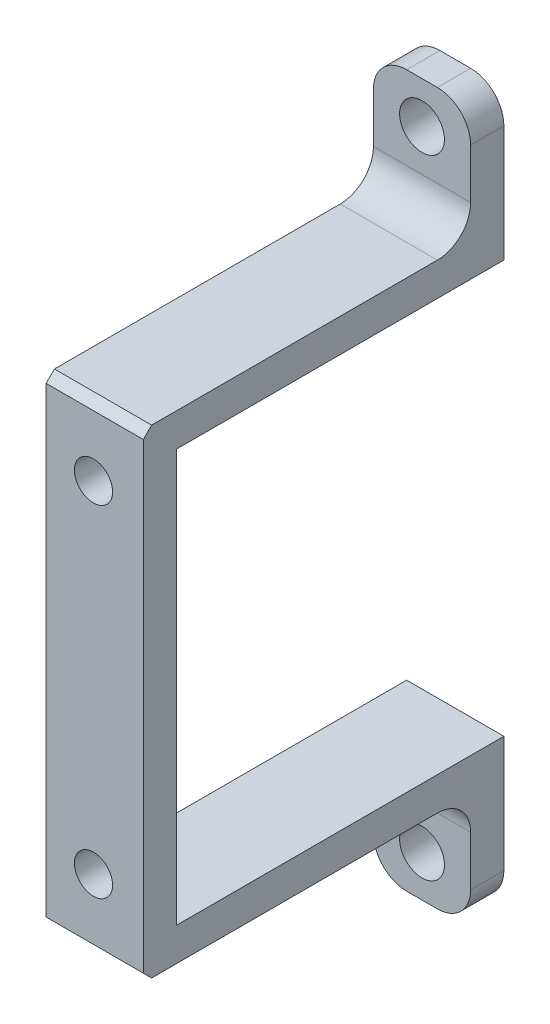
ISO-10303-21;
HEADER;
FILE_DESCRIPTION(('STEP AP214'),'2;1');
FILE_NAME('part.step','',(''),(''),'','','');
FILE_SCHEMA(('AUTOMOTIVE_DESIGN { 1 0 10303 214 1 1 1 1 }'));
ENDSEC;
DATA;
#1=APPLICATION_CONTEXT('core data for automotive mechanical design processes');
#2=APPLICATION_PROTOCOL_DEFINITION('international standard','automotive_design',2000,#1);
#3=PRODUCT_CONTEXT('',#1,'mechanical');
#4=PRODUCT('Part','Part','',(#3));
#5=PRODUCT_RELATED_PRODUCT_CATEGORY('part','',(#4));
#6=PRODUCT_DEFINITION_FORMATION('','',#4);
#7=PRODUCT_DEFINITION_CONTEXT('part definition',#1,'design');
#8=PRODUCT_DEFINITION('design','',#6,#7);
#9=PRODUCT_DEFINITION_SHAPE('','',#8);
#10=(LENGTH_UNIT() NAMED_UNIT(*) SI_UNIT(.MILLI.,.METRE.));
#11=(NAMED_UNIT(*) PLANE_ANGLE_UNIT() SI_UNIT($,.RADIAN.));
#12=(NAMED_UNIT(*) SI_UNIT($,.STERADIAN.) SOLID_ANGLE_UNIT());
#13=UNCERTAINTY_MEASURE_WITH_UNIT(LENGTH_MEASURE(1.E-05),#10,'distance_accuracy_value','');
#14=(GEOMETRIC_REPRESENTATION_CONTEXT(3) GLOBAL_UNCERTAINTY_ASSIGNED_CONTEXT((#13)) GLOBAL_UNIT_ASSIGNED_CONTEXT((#10,
#11,#12)) REPRESENTATION_CONTEXT('',''));
#15=CARTESIAN_POINT('',(0.,0.,0.));
#16=DIRECTION('',(0.,0.,1.));
#17=DIRECTION('',(1.,0.,0.));
#18=AXIS2_PLACEMENT_3D('',#15,#16,#17);
#19=CARTESIAN_POINT('',(-26.2674017645319,-14.41,40.7));
#20=DIRECTION('',(0.,0.707106781186548,-0.707106781186548));
#21=DIRECTION('',(-1.,0.,0.));
#22=AXIS2_PLACEMENT_3D('',#19,#20,#21);
#23=PLANE('',#22);
#24=DIRECTION('',(0.,-0.707106781186548,-0.707106781186548));
#25=VECTOR('',#24,1.);
#26=CARTESIAN_POINT('',(-23.3424017645318,-14.41,40.7));
#27=LINE('',#26,#25);
#28=CARTESIAN_POINT('',(-23.3424017645318,-13.91,41.2));
#29=VERTEX_POINT('',#28);
#30=CARTESIAN_POINT('',(-23.3424017645318,-14.41,40.7));
#31=VERTEX_POINT('',#30);
#32=EDGE_CURVE('E369',#29,#31,#27,.T.);
#33=ORIENTED_EDGE('',*,*,#32,.F.);
#34=DIRECTION('',(1.,0.,0.));
#35=VECTOR('',#34,1.);
#36=CARTESIAN_POINT('',(-38.4174017645319,-13.91,41.2));
#37=LINE('',#36,#35);
#38=CARTESIAN_POINT('',(-29.1924017645318,-13.91,41.2));
#39=VERTEX_POINT('',#38);
#40=EDGE_CURVE('E275',#39,#29,#37,.T.);
#41=ORIENTED_EDGE('',*,*,#40,.F.);
#42=DIRECTION('',(0.,0.707106781186548,0.707106781186548));
#43=VECTOR('',#42,1.);
#44=CARTESIAN_POINT('',(-29.1924017645318,-6.955,48.155));
#45=LINE('',#44,#43);
#46=CARTESIAN_POINT('',(-29.1924017645318,-14.41,40.7));
#47=VERTEX_POINT('',#46);
#48=EDGE_CURVE('E268',#47,#39,#45,.T.);
#49=ORIENTED_EDGE('',*,*,#48,.F.);
#50=DIRECTION('',(-1.,0.,0.));
#51=VECTOR('',#50,1.);
#52=CARTESIAN_POINT('',(-26.2674017645319,-14.41,40.7));
#53=LINE('',#52,#51);
#54=EDGE_CURVE('E374',#31,#47,#53,.T.);
#55=ORIENTED_EDGE('',*,*,#54,.F.);
#56=EDGE_LOOP('',(#33,#41,#49,#55));
#57=FACE_BOUND('',#56,.T.);
#58=ADVANCED_FACE('F17',(#57),#23,.F.);
#59=CARTESIAN_POINT('',(-38.4174017645319,13.91,41.2));
#60=DIRECTION('',(0.,0.707106781186548,0.707106781186548));
#61=DIRECTION('',(1.,0.,0.));
#62=AXIS2_PLACEMENT_3D('',#59,#60,#61);
#63=PLANE('',#62);
#64=DIRECTION('',(0.,-0.707106781186548,0.707106781186548));
#65=VECTOR('',#64,1.);
#66=CARTESIAN_POINT('',(-23.3424017645318,13.91,41.2));
#67=LINE('',#66,#65);
#68=CARTESIAN_POINT('',(-23.3424017645318,14.41,40.7));
#69=VERTEX_POINT('',#68);
#70=CARTESIAN_POINT('',(-23.3424017645318,13.91,41.2));
#71=VERTEX_POINT('',#70);
#72=EDGE_CURVE('E387',#69,#71,#67,.T.);
#73=ORIENTED_EDGE('',*,*,#72,.F.);
#74=DIRECTION('',(1.,0.,0.));
#75=VECTOR('',#74,1.);
#76=CARTESIAN_POINT('',(-23.3424017645318,14.41,40.7));
#77=LINE('',#76,#75);
#78=CARTESIAN_POINT('',(-29.1924017645318,14.41,40.7));
#79=VERTEX_POINT('',#78);
#80=EDGE_CURVE('E407',#79,#69,#77,.T.);
#81=ORIENTED_EDGE('',*,*,#80,.F.);
#82=DIRECTION('',(0.,0.707106781186548,-0.707106781186548));
#83=VECTOR('',#82,1.);
#84=CARTESIAN_POINT('',(-29.1924017645318,6.955,48.155));
#85=LINE('',#84,#83);
#86=CARTESIAN_POINT('',(-29.1924017645318,13.91,41.2));
#87=VERTEX_POINT('',#86);
#88=EDGE_CURVE('E234',#87,#79,#85,.T.);
#89=ORIENTED_EDGE('',*,*,#88,.F.);
#90=DIRECTION('',(-1.,0.,0.));
#91=VECTOR('',#90,1.);
#92=CARTESIAN_POINT('',(-29.1924017645318,13.91,41.2));
#93=LINE('',#92,#91);
#94=EDGE_CURVE('E272',#71,#87,#93,.T.);
#95=ORIENTED_EDGE('',*,*,#94,.F.);
#96=EDGE_LOOP('',(#73,#81,#89,#95));
#97=FACE_BOUND('',#96,.T.);
#98=ADVANCED_FACE('F350',(#97),#63,.T.);
#99=CARTESIAN_POINT('',(-26.2674017645319,18.91,21.5));
#100=DIRECTION('',(0.,0.,-1.));
#101=DIRECTION('',(-1.,0.,0.));
#102=AXIS2_PLACEMENT_3D('',#99,#100,#101);
#103=CYLINDRICAL_SURFACE('',#102,1.35);
#104=CARTESIAN_POINT('',(-26.2674017645319,18.91,19.5));
#105=DIRECTION('',(0.,0.,-1.));
#106=DIRECTION('',(1.,0.,0.));
#107=AXIS2_PLACEMENT_3D('',#104,#105,#106);
#108=CIRCLE('',#107,1.35);
#109=CARTESIAN_POINT('',(-24.9174017645318,18.91,19.5));
#110=VERTEX_POINT('',#109);
#111=EDGE_CURVE('E294',#110,#110,#108,.T.);
#112=ORIENTED_EDGE('',*,*,#111,.T.);
#113=EDGE_LOOP('',(#112));
#114=FACE_BOUND('',#113,.T.);
#115=CARTESIAN_POINT('',(-26.2674017645319,18.91,21.5));
#116=DIRECTION('',(0.,0.,-1.));
#117=DIRECTION('',(-1.,0.,0.));
#118=AXIS2_PLACEMENT_3D('',#115,#116,#117);
#119=CIRCLE('',#118,1.35);
#120=CARTESIAN_POINT('',(-27.6174017645319,18.91,21.5));
#121=VERTEX_POINT('',#120);
#122=EDGE_CURVE('E311',#121,#121,#119,.T.);
#123=ORIENTED_EDGE('',*,*,#122,.F.);
#124=EDGE_LOOP('',(#123));
#125=FACE_BOUND('',#124,.T.);
#126=ADVANCED_FACE('F347',(#114,#125),#103,.F.);
#127=CARTESIAN_POINT('',(-26.2674017645318,-18.91,21.5));
#128=DIRECTION('',(0.,0.,-1.));
#129=DIRECTION('',(-1.,0.,0.));
#130=AXIS2_PLACEMENT_3D('',#127,#128,#129);
#131=CYLINDRICAL_SURFACE('',#130,1.35);
#132=CARTESIAN_POINT('',(-26.2674017645318,-18.91,19.5));
#133=DIRECTION('',(0.,0.,-1.));
#134=DIRECTION('',(1.,0.,0.));
#135=AXIS2_PLACEMENT_3D('',#132,#133,#134);
#136=CIRCLE('',#135,1.35);
#137=CARTESIAN_POINT('',(-24.9174017645318,-18.91,19.5));
#138=VERTEX_POINT('',#137);
#139=EDGE_CURVE('E278',#138,#138,#136,.T.);
#140=ORIENTED_EDGE('',*,*,#139,.T.);
#141=EDGE_LOOP('',(#140));
#142=FACE_BOUND('',#141,.T.);
#143=CARTESIAN_POINT('',(-26.2674017645318,-18.91,21.5));
#144=DIRECTION('',(0.,0.,-1.));
#145=DIRECTION('',(-1.,0.,0.));
#146=AXIS2_PLACEMENT_3D('',#143,#144,#145);
#147=CIRCLE('',#146,1.35);
#148=CARTESIAN_POINT('',(-27.6174017645318,-18.91,21.5));
#149=VERTEX_POINT('',#148);
#150=EDGE_CURVE('E190',#149,#149,#147,.T.);
#151=ORIENTED_EDGE('',*,*,#150,.F.);
#152=EDGE_LOOP('',(#151));
#153=FACE_BOUND('',#152,.T.);
#154=ADVANCED_FACE('F349',(#142,#153),#131,.F.);
#155=CARTESIAN_POINT('',(-26.2674017645319,-16.41,23.5));
#156=DIRECTION('',(-1.,0.,0.));
#157=DIRECTION('',(0.,0.,1.));
#158=AXIS2_PLACEMENT_3D('',#155,#156,#157);
#159=CYLINDRICAL_SURFACE('',#158,2.);
#160=CARTESIAN_POINT('',(-29.1924017645318,-16.41,23.5));
#161=DIRECTION('',(1.,0.,0.));
#162=DIRECTION('',(0.,0.,1.));
#163=AXIS2_PLACEMENT_3D('',#160,#161,#162);
#164=CIRCLE('',#163,2.);
#165=CARTESIAN_POINT('',(-29.1924017645318,-16.41,21.5));
#166=VERTEX_POINT('',#165);
#167=CARTESIAN_POINT('',(-29.1924017645318,-14.41,23.5));
#168=VERTEX_POINT('',#167);
#169=EDGE_CURVE('E264',#166,#168,#164,.T.);
#170=ORIENTED_EDGE('',*,*,#169,.F.);
#171=DIRECTION('',(-1.,0.,0.));
#172=VECTOR('',#171,1.);
#173=CARTESIAN_POINT('',(-29.1924017645318,-16.41,21.5));
#174=LINE('',#173,#172);
#175=CARTESIAN_POINT('',(-23.3424017645318,-16.41,21.5));
#176=VERTEX_POINT('',#175);
#177=EDGE_CURVE('E213',#176,#166,#174,.T.);
#178=ORIENTED_EDGE('',*,*,#177,.F.);
#179=CARTESIAN_POINT('',(-23.3424017645318,-16.41,23.5));
#180=DIRECTION('',(-1.,0.,0.));
#181=DIRECTION('',(0.,0.,1.));
#182=AXIS2_PLACEMENT_3D('',#179,#180,#181);
#183=CIRCLE('',#182,2.);
#184=CARTESIAN_POINT('',(-23.3424017645318,-14.41,23.5));
#185=VERTEX_POINT('',#184);
#186=EDGE_CURVE('E379',#185,#176,#183,.T.);
#187=ORIENTED_EDGE('',*,*,#186,.F.);
#188=DIRECTION('',(1.,0.,0.));
#189=VECTOR('',#188,1.);
#190=CARTESIAN_POINT('',(-23.3424017645318,-14.41,23.5));
#191=LINE('',#190,#189);
#192=EDGE_CURVE('E398',#168,#185,#191,.T.);
#193=ORIENTED_EDGE('',*,*,#192,.F.);
#194=EDGE_LOOP('',(#170,#178,#187,#193));
#195=FACE_BOUND('',#194,.T.);
#196=ADVANCED_FACE('F358',(#195),#159,.F.);
#197=CARTESIAN_POINT('',(-29.1944017645318,16.41,23.5));
#198=DIRECTION('',(-1.,0.,0.));
#199=DIRECTION('',(0.,0.,1.));
#200=AXIS2_PLACEMENT_3D('',#197,#198,#199);
#201=CYLINDRICAL_SURFACE('',#200,2.);
#202=CARTESIAN_POINT('',(-29.1924017645318,16.41,23.5));
#203=DIRECTION('',(1.,0.,0.));
#204=DIRECTION('',(0.,0.,1.));
#205=AXIS2_PLACEMENT_3D('',#202,#203,#204);
#206=CIRCLE('',#205,2.);
#207=CARTESIAN_POINT('',(-29.1924017645318,14.41,23.5));
#208=VERTEX_POINT('',#207);
#209=CARTESIAN_POINT('',(-29.1924017645318,16.41,21.5));
#210=VERTEX_POINT('',#209);
#211=EDGE_CURVE('E235',#208,#210,#206,.T.);
#212=ORIENTED_EDGE('',*,*,#211,.F.);
#213=DIRECTION('',(-1.,0.,0.));
#214=VECTOR('',#213,1.);
#215=CARTESIAN_POINT('',(-29.1924017645318,14.41,23.5));
#216=LINE('',#215,#214);
#217=CARTESIAN_POINT('',(-23.3424017645318,14.41,23.5));
#218=VERTEX_POINT('',#217);
#219=EDGE_CURVE('E421',#218,#208,#216,.T.);
#220=ORIENTED_EDGE('',*,*,#219,.F.);
#221=CARTESIAN_POINT('',(-23.3424017645318,16.41,23.5));
#222=DIRECTION('',(-1.,0.,0.));
#223=DIRECTION('',(0.,0.,1.));
#224=AXIS2_PLACEMENT_3D('',#221,#222,#223);
#225=CIRCLE('',#224,2.);
#226=CARTESIAN_POINT('',(-23.3424017645318,16.41,21.5));
#227=VERTEX_POINT('',#226);
#228=EDGE_CURVE('E477',#227,#218,#225,.T.);
#229=ORIENTED_EDGE('',*,*,#228,.F.);
#230=DIRECTION('',(1.,0.,0.));
#231=VECTOR('',#230,1.);
#232=CARTESIAN_POINT('',(-23.3424017645318,16.41,21.5));
#233=LINE('',#232,#231);
#234=EDGE_CURVE('E321',#210,#227,#233,.T.);
#235=ORIENTED_EDGE('',*,*,#234,.F.);
#236=EDGE_LOOP('',(#212,#220,#229,#235));
#237=FACE_BOUND('',#236,.T.);
#238=ADVANCED_FACE('F536',(#237),#201,.F.);
#239=CARTESIAN_POINT('',(-25.3424017645318,-19.41,20.5));
#240=DIRECTION('',(0.,0.,1.));
#241=DIRECTION('',(1.,0.,0.));
#242=AXIS2_PLACEMENT_3D('',#239,#240,#241);
#243=CYLINDRICAL_SURFACE('',#242,2.);
#244=CARTESIAN_POINT('',(-25.3424017645318,-19.41,19.5));
#245=DIRECTION('',(0.,0.,-1.));
#246=DIRECTION('',(1.,0.,0.));
#247=AXIS2_PLACEMENT_3D('',#244,#245,#246);
#248=CIRCLE('',#247,2.);
#249=CARTESIAN_POINT('',(-23.3424017645318,-19.41,19.5));
#250=VERTEX_POINT('',#249);
#251=CARTESIAN_POINT('',(-25.3424017645318,-21.41,19.5));
#252=VERTEX_POINT('',#251);
#253=EDGE_CURVE('E290',#250,#252,#248,.T.);
#254=ORIENTED_EDGE('',*,*,#253,.F.);
#255=DIRECTION('',(0.,0.,-1.));
#256=VECTOR('',#255,1.);
#257=CARTESIAN_POINT('',(-23.3424017645318,-19.41,41.2));
#258=LINE('',#257,#256);
#259=CARTESIAN_POINT('',(-23.3424017645318,-19.41,21.5));
#260=VERTEX_POINT('',#259);
#261=EDGE_CURVE('E417',#260,#250,#258,.T.);
#262=ORIENTED_EDGE('',*,*,#261,.F.);
#263=CARTESIAN_POINT('',(-25.3424017645318,-19.41,21.5));
#264=DIRECTION('',(0.,0.,1.));
#265=DIRECTION('',(1.,0.,0.));
#266=AXIS2_PLACEMENT_3D('',#263,#264,#265);
#267=CIRCLE('',#266,2.);
#268=CARTESIAN_POINT('',(-25.3424017645318,-21.41,21.5));
#269=VERTEX_POINT('',#268);
#270=EDGE_CURVE('E210',#269,#260,#267,.T.);
#271=ORIENTED_EDGE('',*,*,#270,.F.);
#272=DIRECTION('',(0.,0.,1.));
#273=VECTOR('',#272,1.);
#274=CARTESIAN_POINT('',(-25.3424017645318,-21.41,20.5));
#275=LINE('',#274,#273);
#276=EDGE_CURVE('E11',#252,#269,#275,.T.);
#277=ORIENTED_EDGE('',*,*,#276,.F.);
#278=EDGE_LOOP('',(#254,#262,#271,#277));
#279=FACE_BOUND('',#278,.T.);
#280=ADVANCED_FACE('F532',(#279),#243,.T.);
#281=CARTESIAN_POINT('',(-27.1924017645318,-19.41,41.2));
#282=DIRECTION('',(0.,0.,-1.));
#283=DIRECTION('',(-1.,0.,0.));
#284=AXIS2_PLACEMENT_3D('',#281,#282,#283);
#285=CYLINDRICAL_SURFACE('',#284,2.);
#286=CARTESIAN_POINT('',(-27.1924017645318,-19.41,19.5));
#287=DIRECTION('',(0.,0.,-1.));
#288=DIRECTION('',(1.,0.,0.));
#289=AXIS2_PLACEMENT_3D('',#286,#287,#288);
#290=CIRCLE('',#289,2.);
#291=CARTESIAN_POINT('',(-27.1924017645318,-21.41,19.5));
#292=VERTEX_POINT('',#291);
#293=CARTESIAN_POINT('',(-29.1924017645318,-19.41,19.5));
#294=VERTEX_POINT('',#293);
#295=EDGE_CURVE('E284',#292,#294,#290,.T.);
#296=ORIENTED_EDGE('',*,*,#295,.F.);
#297=DIRECTION('',(0.,0.,-1.));
#298=VECTOR('',#297,1.);
#299=CARTESIAN_POINT('',(-27.1924017645318,-21.41,19.5));
#300=LINE('',#299,#298);
#301=CARTESIAN_POINT('',(-27.1924017645318,-21.41,21.5));
#302=VERTEX_POINT('',#301);
#303=EDGE_CURVE('E20',#302,#292,#300,.T.);
#304=ORIENTED_EDGE('',*,*,#303,.F.);
#305=CARTESIAN_POINT('',(-27.1924017645318,-19.41,21.5));
#306=DIRECTION('',(0.,0.,1.));
#307=DIRECTION('',(1.,0.,0.));
#308=AXIS2_PLACEMENT_3D('',#305,#306,#307);
#309=CIRCLE('',#308,2.);
#310=CARTESIAN_POINT('',(-29.1924017645318,-19.41,21.5));
#311=VERTEX_POINT('',#310);
#312=EDGE_CURVE('E194',#311,#302,#309,.T.);
#313=ORIENTED_EDGE('',*,*,#312,.F.);
#314=DIRECTION('',(0.,0.,1.));
#315=VECTOR('',#314,1.);
#316=CARTESIAN_POINT('',(-29.1924017645318,-19.41,21.5));
#317=LINE('',#316,#315);
#318=EDGE_CURVE('E240',#294,#311,#317,.T.);
#319=ORIENTED_EDGE('',*,*,#318,.F.);
#320=EDGE_LOOP('',(#296,#304,#313,#319));
#321=FACE_BOUND('',#320,.T.);
#322=ADVANCED_FACE('F529',(#321),#285,.T.);
#323=CARTESIAN_POINT('',(-25.3424017645318,19.41,41.2));
#324=DIRECTION('',(0.,0.,-1.));
#325=DIRECTION('',(-1.,0.,0.));
#326=AXIS2_PLACEMENT_3D('',#323,#324,#325);
#327=CYLINDRICAL_SURFACE('',#326,2.);
#328=CARTESIAN_POINT('',(-25.3424017645318,19.41,19.5));
#329=DIRECTION('',(0.,0.,-1.));
#330=DIRECTION('',(1.,0.,0.));
#331=AXIS2_PLACEMENT_3D('',#328,#329,#330);
#332=CIRCLE('',#331,2.);
#333=CARTESIAN_POINT('',(-25.3424017645318,21.41,19.5));
#334=VERTEX_POINT('',#333);
#335=CARTESIAN_POINT('',(-23.3424017645318,19.41,19.5));
#336=VERTEX_POINT('',#335);
#337=EDGE_CURVE('E305',#334,#336,#332,.T.);
#338=ORIENTED_EDGE('',*,*,#337,.F.);
#339=DIRECTION('',(0.,0.,-1.));
#340=VECTOR('',#339,1.);
#341=CARTESIAN_POINT('',(-25.3424017645318,21.41,19.5));
#342=LINE('',#341,#340);
#343=CARTESIAN_POINT('',(-25.3424017645318,21.41,21.5));
#344=VERTEX_POINT('',#343);
#345=EDGE_CURVE('E183',#344,#334,#342,.T.);
#346=ORIENTED_EDGE('',*,*,#345,.F.);
#347=CARTESIAN_POINT('',(-25.3424017645318,19.41,21.5));
#348=DIRECTION('',(0.,0.,1.));
#349=DIRECTION('',(-1.,0.,0.));
#350=AXIS2_PLACEMENT_3D('',#347,#348,#349);
#351=CIRCLE('',#350,2.);
#352=CARTESIAN_POINT('',(-23.3424017645318,19.41,21.5));
#353=VERTEX_POINT('',#352);
#354=EDGE_CURVE('E323',#353,#344,#351,.T.);
#355=ORIENTED_EDGE('',*,*,#354,.F.);
#356=DIRECTION('',(0.,0.,1.));
#357=VECTOR('',#356,1.);
#358=CARTESIAN_POINT('',(-23.3424017645318,19.41,21.5));
#359=LINE('',#358,#357);
#360=EDGE_CURVE('E470',#336,#353,#359,.T.);
#361=ORIENTED_EDGE('',*,*,#360,.F.);
#362=EDGE_LOOP('',(#338,#346,#355,#361));
#363=FACE_BOUND('',#362,.T.);
#364=ADVANCED_FACE('F526',(#363),#327,.T.);
#365=CARTESIAN_POINT('',(-27.1924017645318,19.41,20.5));
#366=DIRECTION('',(0.,0.,1.));
#367=DIRECTION('',(1.,0.,0.));
#368=AXIS2_PLACEMENT_3D('',#365,#366,#367);
#369=CYLINDRICAL_SURFACE('',#368,2.);
#370=CARTESIAN_POINT('',(-27.1924017645318,19.41,19.5));
#371=DIRECTION('',(0.,0.,-1.));
#372=DIRECTION('',(1.,0.,0.));
#373=AXIS2_PLACEMENT_3D('',#370,#371,#372);
#374=CIRCLE('',#373,2.);
#375=CARTESIAN_POINT('',(-29.1924017645318,19.41,19.5));
#376=VERTEX_POINT('',#375);
#377=CARTESIAN_POINT('',(-27.1924017645318,21.41,19.5));
#378=VERTEX_POINT('',#377);
#379=EDGE_CURVE('E296',#376,#378,#374,.T.);
#380=ORIENTED_EDGE('',*,*,#379,.F.);
#381=DIRECTION('',(0.,0.,-1.));
#382=VECTOR('',#381,1.);
#383=CARTESIAN_POINT('',(-29.1924017645318,19.41,41.2));
#384=LINE('',#383,#382);
#385=CARTESIAN_POINT('',(-29.1924017645318,19.41,21.5));
#386=VERTEX_POINT('',#385);
#387=EDGE_CURVE('E246',#386,#376,#384,.T.);
#388=ORIENTED_EDGE('',*,*,#387,.F.);
#389=CARTESIAN_POINT('',(-27.1924017645318,19.41,21.5));
#390=DIRECTION('',(0.,0.,1.));
#391=DIRECTION('',(-1.,0.,0.));
#392=AXIS2_PLACEMENT_3D('',#389,#390,#391);
#393=CIRCLE('',#392,2.);
#394=CARTESIAN_POINT('',(-27.1924017645318,21.41,21.5));
#395=VERTEX_POINT('',#394);
#396=EDGE_CURVE('E318',#395,#386,#393,.T.);
#397=ORIENTED_EDGE('',*,*,#396,.F.);
#398=DIRECTION('',(0.,0.,1.));
#399=VECTOR('',#398,1.);
#400=CARTESIAN_POINT('',(-27.1924017645318,21.41,20.5));
#401=LINE('',#400,#399);
#402=EDGE_CURVE('E203',#378,#395,#401,.T.);
#403=ORIENTED_EDGE('',*,*,#402,.F.);
#404=EDGE_LOOP('',(#380,#388,#397,#403));
#405=FACE_BOUND('',#404,.T.);
#406=ADVANCED_FACE('F337',(#405),#369,.T.);
#407=CARTESIAN_POINT('',(-29.1944017645318,-21.41,20.5));
#408=DIRECTION('',(0.,1.,0.));
#409=DIRECTION('',(1.,0.,0.));
#410=AXIS2_PLACEMENT_3D('',#407,#408,#409);
#411=PLANE('',#410);
#412=DIRECTION('',(1.,0.,0.));
#413=VECTOR('',#412,1.);
#414=CARTESIAN_POINT('',(-29.1944017645318,-21.41,21.5));
#415=LINE('',#414,#413);
#416=EDGE_CURVE('E201',#302,#269,#415,.T.);
#417=ORIENTED_EDGE('',*,*,#416,.F.);
#418=ORIENTED_EDGE('',*,*,#303,.T.);
#419=DIRECTION('',(1.,0.,0.));
#420=VECTOR('',#419,1.);
#421=CARTESIAN_POINT('',(-29.1944017645318,-21.41,19.5));
#422=LINE('',#421,#420);
#423=EDGE_CURVE('E280',#292,#252,#422,.T.);
#424=ORIENTED_EDGE('',*,*,#423,.T.);
#425=ORIENTED_EDGE('',*,*,#276,.T.);
#426=EDGE_LOOP('',(#417,#418,#424,#425));
#427=FACE_BOUND('',#426,.T.);
#428=ADVANCED_FACE('F519',(#427),#411,.F.);
#429=CARTESIAN_POINT('',(-29.1944017645318,-17.91,21.5));
#430=DIRECTION('',(0.,0.,1.));
#431=DIRECTION('',(1.,0.,0.));
#432=AXIS2_PLACEMENT_3D('',#429,#430,#431);
#433=PLANE('',#432);
#434=DIRECTION('',(0.,-1.,0.));
#435=VECTOR('',#434,1.);
#436=CARTESIAN_POINT('',(-29.1924017645318,-17.91,21.5));
#437=LINE('',#436,#435);
#438=EDGE_CURVE('E244',#166,#311,#437,.T.);
#439=ORIENTED_EDGE('',*,*,#438,.T.);
#440=ORIENTED_EDGE('',*,*,#312,.T.);
#441=ORIENTED_EDGE('',*,*,#416,.T.);
#442=ORIENTED_EDGE('',*,*,#270,.T.);
#443=DIRECTION('',(0.,-1.,0.));
#444=VECTOR('',#443,1.);
#445=CARTESIAN_POINT('',(-23.3424017645318,-17.91,21.5));
#446=LINE('',#445,#444);
#447=EDGE_CURVE('E449',#176,#260,#446,.T.);
#448=ORIENTED_EDGE('',*,*,#447,.F.);
#449=ORIENTED_EDGE('',*,*,#177,.T.);
#450=EDGE_LOOP('',(#439,#440,#441,#442,#448,#449));
#451=FACE_BOUND('',#450,.T.);
#452=ORIENTED_EDGE('',*,*,#150,.T.);
#453=EDGE_LOOP('',(#452));
#454=FACE_BOUND('',#453,.T.);
#455=ADVANCED_FACE('F191',(#451,#454),#433,.T.);
#456=CARTESIAN_POINT('',(-29.1944017645318,21.41,20.5));
#457=DIRECTION('',(0.,1.,0.));
#458=DIRECTION('',(1.,0.,0.));
#459=AXIS2_PLACEMENT_3D('',#456,#457,#458);
#460=PLANE('',#459);
#461=DIRECTION('',(1.,0.,0.));
#462=VECTOR('',#461,1.);
#463=CARTESIAN_POINT('',(-29.1944017645318,21.41,19.5));
#464=LINE('',#463,#462);
#465=EDGE_CURVE('E301',#378,#334,#464,.T.);
#466=ORIENTED_EDGE('',*,*,#465,.F.);
#467=ORIENTED_EDGE('',*,*,#402,.T.);
#468=DIRECTION('',(1.,0.,0.));
#469=VECTOR('',#468,1.);
#470=CARTESIAN_POINT('',(-29.1944017645318,21.41,21.5));
#471=LINE('',#470,#469);
#472=EDGE_CURVE('E314',#395,#344,#471,.T.);
#473=ORIENTED_EDGE('',*,*,#472,.T.);
#474=ORIENTED_EDGE('',*,*,#345,.T.);
#475=EDGE_LOOP('',(#466,#467,#473,#474));
#476=FACE_BOUND('',#475,.T.);
#477=ADVANCED_FACE('F334',(#476),#460,.T.);
#478=CARTESIAN_POINT('',(-29.1944017645318,17.91,21.5));
#479=DIRECTION('',(0.,0.,-1.));
#480=DIRECTION('',(0.,-1.,0.));
#481=AXIS2_PLACEMENT_3D('',#478,#479,#480);
#482=PLANE('',#481);
#483=ORIENTED_EDGE('',*,*,#472,.F.);
#484=ORIENTED_EDGE('',*,*,#396,.T.);
#485=DIRECTION('',(0.,1.,0.));
#486=VECTOR('',#485,1.);
#487=CARTESIAN_POINT('',(-29.1924017645318,17.91,21.5));
#488=LINE('',#487,#486);
#489=EDGE_CURVE('E239',#210,#386,#488,.T.);
#490=ORIENTED_EDGE('',*,*,#489,.F.);
#491=ORIENTED_EDGE('',*,*,#234,.T.);
#492=DIRECTION('',(0.,1.,0.));
#493=VECTOR('',#492,1.);
#494=CARTESIAN_POINT('',(-23.3424017645318,17.91,21.5));
#495=LINE('',#494,#493);
#496=EDGE_CURVE('E474',#227,#353,#495,.T.);
#497=ORIENTED_EDGE('',*,*,#496,.T.);
#498=ORIENTED_EDGE('',*,*,#354,.T.);
#499=EDGE_LOOP('',(#483,#484,#490,#491,#497,#498));
#500=FACE_BOUND('',#499,.T.);
#501=ORIENTED_EDGE('',*,*,#122,.T.);
#502=EDGE_LOOP('',(#501));
#503=FACE_BOUND('',#502,.T.);
#504=ADVANCED_FACE('F340',(#500,#503),#482,.F.);
#505=CARTESIAN_POINT('',(-26.2674017645319,12.41,11.498));
#506=DIRECTION('',(0.,1.,0.));
#507=DIRECTION('',(1.,0.,0.));
#508=AXIS2_PLACEMENT_3D('',#505,#506,#507);
#509=PLANE('',#508);
#510=DIRECTION('',(0.,0.,1.));
#511=VECTOR('',#510,1.);
#512=CARTESIAN_POINT('',(-29.1924017645318,12.41,11.498));
#513=LINE('',#512,#511);
#514=CARTESIAN_POINT('',(-29.1924017645318,12.41,19.5));
#515=VERTEX_POINT('',#514);
#516=CARTESIAN_POINT('',(-29.1924017645318,12.41,39.2));
#517=VERTEX_POINT('',#516);
#518=EDGE_CURVE('E254',#515,#517,#513,.T.);
#519=ORIENTED_EDGE('',*,*,#518,.F.);
#520=DIRECTION('',(1.,0.,0.));
#521=VECTOR('',#520,1.);
#522=CARTESIAN_POINT('',(-26.2674017645319,12.41,19.5));
#523=LINE('',#522,#521);
#524=CARTESIAN_POINT('',(-23.3424017645318,12.41,19.5));
#525=VERTEX_POINT('',#524);
#526=EDGE_CURVE('E308',#515,#525,#523,.T.);
#527=ORIENTED_EDGE('',*,*,#526,.T.);
#528=DIRECTION('',(0.,0.,1.));
#529=VECTOR('',#528,1.);
#530=CARTESIAN_POINT('',(-23.3424017645318,12.41,11.498));
#531=LINE('',#530,#529);
#532=CARTESIAN_POINT('',(-23.3424017645318,12.41,39.2));
#533=VERTEX_POINT('',#532);
#534=EDGE_CURVE('E463',#525,#533,#531,.T.);
#535=ORIENTED_EDGE('',*,*,#534,.T.);
#536=DIRECTION('',(-1.,0.,0.));
#537=VECTOR('',#536,1.);
#538=CARTESIAN_POINT('',(-26.2674017645319,12.41,39.2));
#539=LINE('',#538,#537);
#540=EDGE_CURVE('E436',#533,#517,#539,.T.);
#541=ORIENTED_EDGE('',*,*,#540,.T.);
#542=EDGE_LOOP('',(#519,#527,#535,#541));
#543=FACE_BOUND('',#542,.T.);
#544=ADVANCED_FACE('F343',(#543),#509,.F.);
#545=CARTESIAN_POINT('',(4.,0.,19.5));
#546=DIRECTION('',(0.,0.,1.));
#547=DIRECTION('',(1.,0.,0.));
#548=AXIS2_PLACEMENT_3D('',#545,#546,#547);
#549=PLANE('',#548);
#550=DIRECTION('',(0.,1.,0.));
#551=VECTOR('',#550,1.);
#552=CARTESIAN_POINT('',(-29.1924017645318,13.41,19.5));
#553=LINE('',#552,#551);
#554=EDGE_CURVE('E250',#515,#376,#553,.T.);
#555=ORIENTED_EDGE('',*,*,#554,.T.);
#556=ORIENTED_EDGE('',*,*,#379,.T.);
#557=ORIENTED_EDGE('',*,*,#465,.T.);
#558=ORIENTED_EDGE('',*,*,#337,.T.);
#559=DIRECTION('',(0.,1.,0.));
#560=VECTOR('',#559,1.);
#561=CARTESIAN_POINT('',(-23.3424017645318,13.41,19.5));
#562=LINE('',#561,#560);
#563=EDGE_CURVE('E466',#525,#336,#562,.T.);
#564=ORIENTED_EDGE('',*,*,#563,.F.);
#565=ORIENTED_EDGE('',*,*,#526,.F.);
#566=EDGE_LOOP('',(#555,#556,#557,#558,#564,#565));
#567=FACE_BOUND('',#566,.T.);
#568=ORIENTED_EDGE('',*,*,#111,.F.);
#569=EDGE_LOOP('',(#568));
#570=FACE_BOUND('',#569,.T.);
#571=ADVANCED_FACE('F935',(#567,#570),#549,.F.);
#572=CARTESIAN_POINT('',(-26.2674017645319,-12.41,11.498));
#573=DIRECTION('',(0.,1.,0.));
#574=DIRECTION('',(1.,0.,0.));
#575=AXIS2_PLACEMENT_3D('',#572,#573,#574);
#576=PLANE('',#575);
#577=DIRECTION('',(1.,0.,0.));
#578=VECTOR('',#577,1.);
#579=CARTESIAN_POINT('',(4.,-12.41,19.5));
#580=LINE('',#579,#578);
#581=CARTESIAN_POINT('',(-29.1924017645318,-12.41,19.5));
#582=VERTEX_POINT('',#581);
#583=CARTESIAN_POINT('',(-23.3424017645318,-12.41,19.5));
#584=VERTEX_POINT('',#583);
#585=EDGE_CURVE('E287',#582,#584,#580,.T.);
#586=ORIENTED_EDGE('',*,*,#585,.F.);
#587=DIRECTION('',(0.,0.,1.));
#588=VECTOR('',#587,1.);
#589=CARTESIAN_POINT('',(-29.1924017645318,-12.41,11.498));
#590=LINE('',#589,#588);
#591=CARTESIAN_POINT('',(-29.1924017645318,-12.41,39.2));
#592=VERTEX_POINT('',#591);
#593=EDGE_CURVE('E258',#582,#592,#590,.T.);
#594=ORIENTED_EDGE('',*,*,#593,.T.);
#595=DIRECTION('',(-1.,0.,0.));
#596=VECTOR('',#595,1.);
#597=CARTESIAN_POINT('',(-26.2674017645319,-12.41,39.2));
#598=LINE('',#597,#596);
#599=CARTESIAN_POINT('',(-23.3424017645318,-12.41,39.2));
#600=VERTEX_POINT('',#599);
#601=EDGE_CURVE('E426',#600,#592,#598,.T.);
#602=ORIENTED_EDGE('',*,*,#601,.F.);
#603=DIRECTION('',(0.,0.,1.));
#604=VECTOR('',#603,1.);
#605=CARTESIAN_POINT('',(-23.3424017645318,-12.41,11.498));
#606=LINE('',#605,#604);
#607=EDGE_CURVE('E416',#584,#600,#606,.T.);
#608=ORIENTED_EDGE('',*,*,#607,.F.);
#609=EDGE_LOOP('',(#586,#594,#602,#608));
#610=FACE_BOUND('',#609,.T.);
#611=ADVANCED_FACE('F512',(#610),#576,.T.);
#612=CARTESIAN_POINT('',(4.,0.,19.5));
#613=DIRECTION('',(0.,0.,1.));
#614=DIRECTION('',(1.,0.,0.));
#615=AXIS2_PLACEMENT_3D('',#612,#613,#614);
#616=PLANE('',#615);
#617=ORIENTED_EDGE('',*,*,#423,.F.);
#618=ORIENTED_EDGE('',*,*,#295,.T.);
#619=DIRECTION('',(0.,-1.,0.));
#620=VECTOR('',#619,1.);
#621=CARTESIAN_POINT('',(-29.1924017645318,-13.41,19.5));
#622=LINE('',#621,#620);
#623=EDGE_CURVE('E245',#582,#294,#622,.T.);
#624=ORIENTED_EDGE('',*,*,#623,.F.);
#625=ORIENTED_EDGE('',*,*,#585,.T.);
#626=DIRECTION('',(0.,-1.,0.));
#627=VECTOR('',#626,1.);
#628=CARTESIAN_POINT('',(-23.3424017645318,-13.41,19.5));
#629=LINE('',#628,#627);
#630=EDGE_CURVE('E412',#584,#250,#629,.T.);
#631=ORIENTED_EDGE('',*,*,#630,.T.);
#632=ORIENTED_EDGE('',*,*,#253,.T.);
#633=EDGE_LOOP('',(#617,#618,#624,#625,#631,#632));
#634=FACE_BOUND('',#633,.T.);
#635=ORIENTED_EDGE('',*,*,#139,.F.);
#636=EDGE_LOOP('',(#635));
#637=FACE_BOUND('',#636,.T.);
#638=ADVANCED_FACE('F494',(#634,#637),#616,.F.);
#639=CARTESIAN_POINT('',(-38.4174017645319,0.,41.2));
#640=DIRECTION('',(0.,0.,1.));
#641=DIRECTION('',(1.,0.,0.));
#642=AXIS2_PLACEMENT_3D('',#639,#640,#641);
#643=PLANE('',#642);
#644=DIRECTION('',(0.,1.,0.));
#645=VECTOR('',#644,1.);
#646=CARTESIAN_POINT('',(-23.3424017645318,0.,41.2));
#647=LINE('',#646,#645);
#648=EDGE_CURVE('E380',#29,#71,#647,.T.);
#649=ORIENTED_EDGE('',*,*,#648,.T.);
#650=ORIENTED_EDGE('',*,*,#94,.T.);
#651=DIRECTION('',(0.,1.,0.));
#652=VECTOR('',#651,1.);
#653=CARTESIAN_POINT('',(-29.1924017645318,0.,41.2));
#654=LINE('',#653,#652);
#655=EDGE_CURVE('E230',#39,#87,#654,.T.);
#656=ORIENTED_EDGE('',*,*,#655,.F.);
#657=ORIENTED_EDGE('',*,*,#40,.T.);
#658=EDGE_LOOP('',(#649,#650,#656,#657));
#659=FACE_BOUND('',#658,.T.);
#660=CARTESIAN_POINT('',(-26.3424017645318,10.25,41.2));
#661=DIRECTION('',(0.,0.,1.));
#662=DIRECTION('',(1.,0.,0.));
#663=AXIS2_PLACEMENT_3D('',#660,#661,#662);
#664=CIRCLE('',#663,1.15);
#665=CARTESIAN_POINT('',(-25.1924017645319,10.25,41.2));
#666=VERTEX_POINT('',#665);
#667=EDGE_CURVE('E226',#666,#666,#664,.T.);
#668=ORIENTED_EDGE('',*,*,#667,.F.);
#669=EDGE_LOOP('',(#668));
#670=FACE_BOUND('',#669,.T.);
#671=CARTESIAN_POINT('',(-26.3424017645318,-10.25,41.2));
#672=DIRECTION('',(0.,0.,1.));
#673=DIRECTION('',(1.,0.,0.));
#674=AXIS2_PLACEMENT_3D('',#671,#672,#673);
#675=CIRCLE('',#674,1.15);
#676=CARTESIAN_POINT('',(-25.1924017645319,-10.25,41.2));
#677=VERTEX_POINT('',#676);
#678=EDGE_CURVE('E227',#677,#677,#675,.T.);
#679=ORIENTED_EDGE('',*,*,#678,.F.);
#680=EDGE_LOOP('',(#679));
#681=FACE_BOUND('',#680,.T.);
#682=ADVANCED_FACE('F490',(#659,#670,#681),#643,.T.);
#683=CARTESIAN_POINT('',(-29.1924017645318,0.,41.2));
#684=DIRECTION('',(-1.,0.,0.));
#685=DIRECTION('',(0.,0.,1.));
#686=AXIS2_PLACEMENT_3D('',#683,#684,#685);
#687=PLANE('',#686);
#688=ORIENTED_EDGE('',*,*,#655,.T.);
#689=ORIENTED_EDGE('',*,*,#88,.T.);
#690=DIRECTION('',(0.,0.,-1.));
#691=VECTOR('',#690,1.);
#692=CARTESIAN_POINT('',(-29.1924017645318,14.41,41.2));
#693=LINE('',#692,#691);
#694=EDGE_CURVE('E402',#79,#208,#693,.T.);
#695=ORIENTED_EDGE('',*,*,#694,.T.);
#696=ORIENTED_EDGE('',*,*,#211,.T.);
#697=ORIENTED_EDGE('',*,*,#489,.T.);
#698=ORIENTED_EDGE('',*,*,#387,.T.);
#699=ORIENTED_EDGE('',*,*,#554,.F.);
#700=ORIENTED_EDGE('',*,*,#518,.T.);
#701=DIRECTION('',(0.,1.,0.));
#702=VECTOR('',#701,1.);
#703=CARTESIAN_POINT('',(-29.1924017645318,0.,39.2));
#704=LINE('',#703,#702);
#705=EDGE_CURVE('E393',#592,#517,#704,.T.);
#706=ORIENTED_EDGE('',*,*,#705,.F.);
#707=ORIENTED_EDGE('',*,*,#593,.F.);
#708=ORIENTED_EDGE('',*,*,#623,.T.);
#709=ORIENTED_EDGE('',*,*,#318,.T.);
#710=ORIENTED_EDGE('',*,*,#438,.F.);
#711=ORIENTED_EDGE('',*,*,#169,.T.);
#712=DIRECTION('',(0.,0.,-1.));
#713=VECTOR('',#712,1.);
#714=CARTESIAN_POINT('',(-29.1924017645318,-14.41,41.2));
#715=LINE('',#714,#713);
#716=EDGE_CURVE('E403',#47,#168,#715,.T.);
#717=ORIENTED_EDGE('',*,*,#716,.F.);
#718=ORIENTED_EDGE('',*,*,#48,.T.);
#719=EDGE_LOOP('',(#688,#689,#695,#696,#697,#698,#699,#700,#706,#707,#708,#709,#710,#711,#717,#718));
#720=FACE_BOUND('',#719,.T.);
#721=ADVANCED_FACE('F493',(#720),#687,.T.);
#722=CARTESIAN_POINT('',(-26.3424017645318,-10.25,41.2));
#723=DIRECTION('',(0.,0.,-1.));
#724=DIRECTION('',(-1.,0.,0.));
#725=AXIS2_PLACEMENT_3D('',#722,#723,#724);
#726=CYLINDRICAL_SURFACE('',#725,1.15);
#727=CARTESIAN_POINT('',(-26.3424017645318,-10.25,39.2));
#728=DIRECTION('',(0.,0.,1.));
#729=DIRECTION('',(1.,0.,0.));
#730=AXIS2_PLACEMENT_3D('',#727,#728,#729);
#731=CIRCLE('',#730,1.15);
#732=CARTESIAN_POINT('',(-25.1924017645319,-10.25,39.2));
#733=VERTEX_POINT('',#732);
#734=EDGE_CURVE('E432',#733,#733,#731,.T.);
#735=ORIENTED_EDGE('',*,*,#734,.F.);
#736=EDGE_LOOP('',(#735));
#737=FACE_BOUND('',#736,.T.);
#738=ORIENTED_EDGE('',*,*,#678,.T.);
#739=EDGE_LOOP('',(#738));
#740=FACE_BOUND('',#739,.T.);
#741=ADVANCED_FACE('F498',(#737,#740),#726,.F.);
#742=CARTESIAN_POINT('',(-26.3424017645318,10.25,41.2));
#743=DIRECTION('',(0.,0.,-1.));
#744=DIRECTION('',(-1.,0.,0.));
#745=AXIS2_PLACEMENT_3D('',#742,#743,#744);
#746=CYLINDRICAL_SURFACE('',#745,1.15);
#747=CARTESIAN_POINT('',(-26.3424017645318,10.25,39.2));
#748=DIRECTION('',(0.,0.,1.));
#749=DIRECTION('',(1.,0.,0.));
#750=AXIS2_PLACEMENT_3D('',#747,#748,#749);
#751=CIRCLE('',#750,1.15);
#752=CARTESIAN_POINT('',(-25.1924017645319,10.25,39.2));
#753=VERTEX_POINT('',#752);
#754=EDGE_CURVE('E425',#753,#753,#751,.T.);
#755=ORIENTED_EDGE('',*,*,#754,.F.);
#756=EDGE_LOOP('',(#755));
#757=FACE_BOUND('',#756,.T.);
#758=ORIENTED_EDGE('',*,*,#667,.T.);
#759=EDGE_LOOP('',(#758));
#760=FACE_BOUND('',#759,.T.);
#761=ADVANCED_FACE('F488',(#757,#760),#746,.F.);
#762=CARTESIAN_POINT('',(-23.3424017645318,0.,41.2));
#763=DIRECTION('',(-1.,0.,0.));
#764=DIRECTION('',(0.,0.,1.));
#765=AXIS2_PLACEMENT_3D('',#762,#763,#764);
#766=PLANE('',#765);
#767=DIRECTION('',(0.,0.,-1.));
#768=VECTOR('',#767,1.);
#769=CARTESIAN_POINT('',(-23.3424017645318,14.41,41.2));
#770=LINE('',#769,#768);
#771=EDGE_CURVE('E411',#69,#218,#770,.T.);
#772=ORIENTED_EDGE('',*,*,#771,.F.);
#773=ORIENTED_EDGE('',*,*,#72,.T.);
#774=ORIENTED_EDGE('',*,*,#648,.F.);
#775=ORIENTED_EDGE('',*,*,#32,.T.);
#776=DIRECTION('',(0.,0.,-1.));
#777=VECTOR('',#776,1.);
#778=CARTESIAN_POINT('',(-23.3424017645318,-14.41,41.2));
#779=LINE('',#778,#777);
#780=EDGE_CURVE('E560',#31,#185,#779,.T.);
#781=ORIENTED_EDGE('',*,*,#780,.T.);
#782=ORIENTED_EDGE('',*,*,#186,.T.);
#783=ORIENTED_EDGE('',*,*,#447,.T.);
#784=ORIENTED_EDGE('',*,*,#261,.T.);
#785=ORIENTED_EDGE('',*,*,#630,.F.);
#786=ORIENTED_EDGE('',*,*,#607,.T.);
#787=DIRECTION('',(0.,1.,0.));
#788=VECTOR('',#787,1.);
#789=CARTESIAN_POINT('',(-23.3424017645318,0.,39.2));
#790=LINE('',#789,#788);
#791=EDGE_CURVE('E430',#600,#533,#790,.T.);
#792=ORIENTED_EDGE('',*,*,#791,.T.);
#793=ORIENTED_EDGE('',*,*,#534,.F.);
#794=ORIENTED_EDGE('',*,*,#563,.T.);
#795=ORIENTED_EDGE('',*,*,#360,.T.);
#796=ORIENTED_EDGE('',*,*,#496,.F.);
#797=ORIENTED_EDGE('',*,*,#228,.T.);
#798=EDGE_LOOP('',(#772,#773,#774,#775,#781,#782,#783,#784,#785,#786,#792,#793,#794,#795,#796,#797));
#799=FACE_BOUND('',#798,.T.);
#800=ADVANCED_FACE('F385',(#799),#766,.F.);
#801=CARTESIAN_POINT('',(-38.4174017645319,0.,39.2));
#802=DIRECTION('',(0.,0.,1.));
#803=DIRECTION('',(1.,0.,0.));
#804=AXIS2_PLACEMENT_3D('',#801,#802,#803);
#805=PLANE('',#804);
#806=ORIENTED_EDGE('',*,*,#540,.F.);
#807=ORIENTED_EDGE('',*,*,#791,.F.);
#808=ORIENTED_EDGE('',*,*,#601,.T.);
#809=ORIENTED_EDGE('',*,*,#705,.T.);
#810=EDGE_LOOP('',(#806,#807,#808,#809));
#811=FACE_BOUND('',#810,.T.);
#812=ORIENTED_EDGE('',*,*,#734,.T.);
#813=EDGE_LOOP('',(#812));
#814=FACE_BOUND('',#813,.T.);
#815=ORIENTED_EDGE('',*,*,#754,.T.);
#816=EDGE_LOOP('',(#815));
#817=FACE_BOUND('',#816,.T.);
#818=ADVANCED_FACE('F948',(#811,#814,#817),#805,.F.);
#819=CARTESIAN_POINT('',(-26.2674017645319,14.41,41.2));
#820=DIRECTION('',(0.,-1.,0.));
#821=DIRECTION('',(0.,0.,-1.));
#822=AXIS2_PLACEMENT_3D('',#819,#820,#821);
#823=PLANE('',#822);
#824=ORIENTED_EDGE('',*,*,#694,.F.);
#825=ORIENTED_EDGE('',*,*,#80,.T.);
#826=ORIENTED_EDGE('',*,*,#771,.T.);
#827=ORIENTED_EDGE('',*,*,#219,.T.);
#828=EDGE_LOOP('',(#824,#825,#826,#827));
#829=FACE_BOUND('',#828,.T.);
#830=ADVANCED_FACE('F956',(#829),#823,.F.);
#831=CARTESIAN_POINT('',(-26.2674017645319,-14.41,41.2));
#832=DIRECTION('',(0.,-1.,0.));
#833=DIRECTION('',(0.,0.,-1.));
#834=AXIS2_PLACEMENT_3D('',#831,#832,#833);
#835=PLANE('',#834);
#836=ORIENTED_EDGE('',*,*,#780,.F.);
#837=ORIENTED_EDGE('',*,*,#54,.T.);
#838=ORIENTED_EDGE('',*,*,#716,.T.);
#839=ORIENTED_EDGE('',*,*,#192,.T.);
#840=EDGE_LOOP('',(#836,#837,#838,#839));
#841=FACE_BOUND('',#840,.T.);
#842=ADVANCED_FACE('F565',(#841),#835,.T.);
#843=CLOSED_SHELL('',(#58,#98,#126,#154,#196,#238,#280,#322,#364,#406,#428,#455,#477,#504,#544,
#571,#611,#638,#682,#721,#741,#761,#800,#818,#830,#842));
#844=MANIFOLD_SOLID_BREP('B1',#843);
#845=ADVANCED_BREP_SHAPE_REPRESENTATION('',(#18,#844),#14);
#846=SHAPE_DEFINITION_REPRESENTATION(#9,#845);
ENDSEC;
END-ISO-10303-21;
